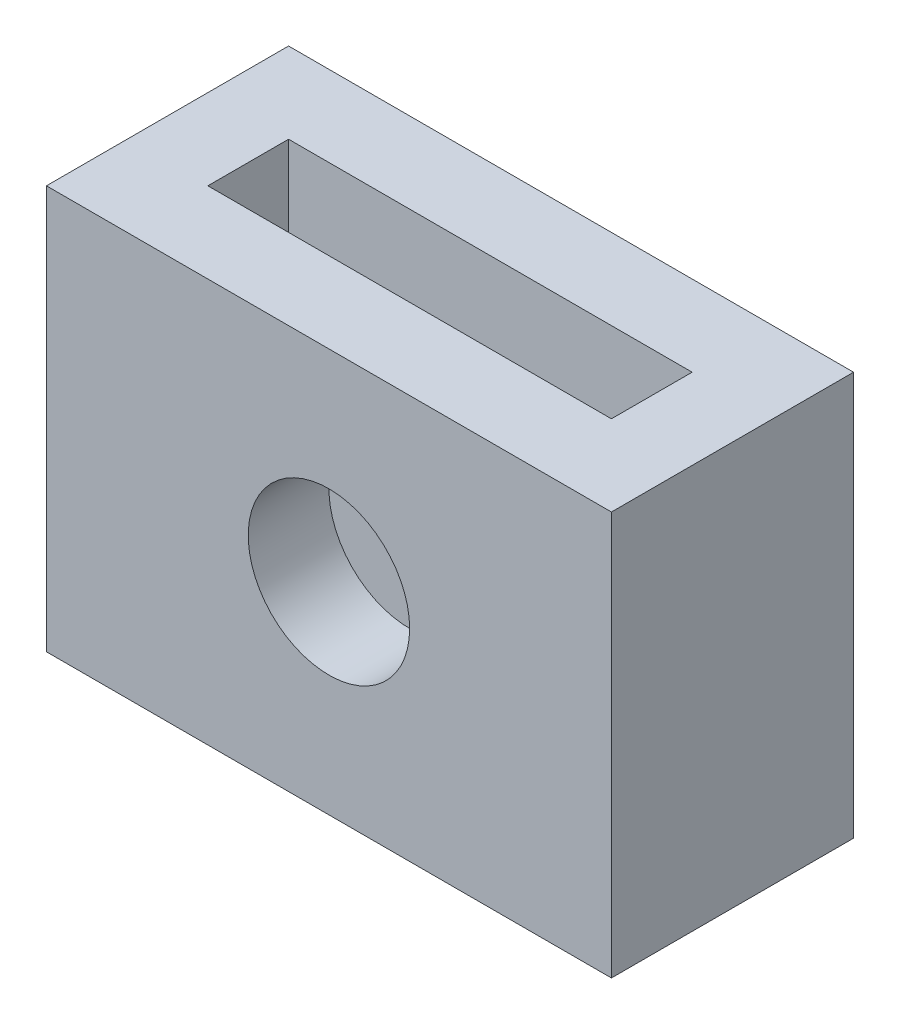
ISO-10303-21;
HEADER;
FILE_DESCRIPTION(('STEP AP214'),'2;1');
FILE_NAME('part.step','',(''),(''),'','','');
FILE_SCHEMA(('AUTOMOTIVE_DESIGN { 1 0 10303 214 1 1 1 1 }'));
ENDSEC;
DATA;
#1=APPLICATION_CONTEXT('core data for automotive mechanical design processes');
#2=APPLICATION_PROTOCOL_DEFINITION('international standard','automotive_design',2000,#1);
#3=PRODUCT_CONTEXT('',#1,'mechanical');
#4=PRODUCT('Part','Part','',(#3));
#5=PRODUCT_RELATED_PRODUCT_CATEGORY('part','',(#4));
#6=PRODUCT_DEFINITION_FORMATION('','',#4);
#7=PRODUCT_DEFINITION_CONTEXT('part definition',#1,'design');
#8=PRODUCT_DEFINITION('design','',#6,#7);
#9=PRODUCT_DEFINITION_SHAPE('','',#8);
#10=(LENGTH_UNIT() NAMED_UNIT(*) SI_UNIT(.MILLI.,.METRE.));
#11=(NAMED_UNIT(*) PLANE_ANGLE_UNIT() SI_UNIT($,.RADIAN.));
#12=(NAMED_UNIT(*) SI_UNIT($,.STERADIAN.) SOLID_ANGLE_UNIT());
#13=UNCERTAINTY_MEASURE_WITH_UNIT(LENGTH_MEASURE(1.E-05),#10,'distance_accuracy_value','');
#14=(GEOMETRIC_REPRESENTATION_CONTEXT(3) GLOBAL_UNCERTAINTY_ASSIGNED_CONTEXT((#13)) GLOBAL_UNIT_ASSIGNED_CONTEXT((#10,
#11,#12)) REPRESENTATION_CONTEXT('',''));
#15=CARTESIAN_POINT('',(0.,0.,0.));
#16=DIRECTION('',(0.,0.,1.));
#17=DIRECTION('',(1.,0.,0.));
#18=AXIS2_PLACEMENT_3D('',#15,#16,#17);
#19=CARTESIAN_POINT('',(0.,0.,30.));
#20=DIRECTION('',(0.,1.,0.));
#21=DIRECTION('',(0.,0.,1.));
#22=AXIS2_PLACEMENT_3D('',#19,#20,#21);
#23=PLANE('',#22);
#24=DIRECTION('',(1.,0.,0.));
#25=VECTOR('',#24,1.);
#26=CARTESIAN_POINT('',(0.,0.,0.));
#27=LINE('',#26,#25);
#28=CARTESIAN_POINT('',(0.,0.,0.));
#29=VERTEX_POINT('',#28);
#30=CARTESIAN_POINT('',(70.,0.,0.));
#31=VERTEX_POINT('',#30);
#32=EDGE_CURVE('E142',#29,#31,#27,.T.);
#33=ORIENTED_EDGE('',*,*,#32,.T.);
#34=DIRECTION('',(0.,0.,-1.));
#35=VECTOR('',#34,1.);
#36=CARTESIAN_POINT('',(70.,0.,30.));
#37=LINE('',#36,#35);
#38=CARTESIAN_POINT('',(70.,0.,30.));
#39=VERTEX_POINT('',#38);
#40=EDGE_CURVE('E152',#39,#31,#37,.T.);
#41=ORIENTED_EDGE('',*,*,#40,.F.);
#42=DIRECTION('',(1.,0.,0.));
#43=VECTOR('',#42,1.);
#44=CARTESIAN_POINT('',(0.,0.,30.));
#45=LINE('',#44,#43);
#46=CARTESIAN_POINT('',(0.,0.,30.));
#47=VERTEX_POINT('',#46);
#48=EDGE_CURVE('E132',#47,#39,#45,.T.);
#49=ORIENTED_EDGE('',*,*,#48,.F.);
#50=DIRECTION('',(0.,0.,-1.));
#51=VECTOR('',#50,1.);
#52=CARTESIAN_POINT('',(0.,0.,30.));
#53=LINE('',#52,#51);
#54=EDGE_CURVE('E155',#47,#29,#53,.T.);
#55=ORIENTED_EDGE('',*,*,#54,.T.);
#56=EDGE_LOOP('',(#33,#41,#49,#55));
#57=FACE_BOUND('',#56,.T.);
#58=DIRECTION('',(1.,0.,0.));
#59=VECTOR('',#58,1.);
#60=CARTESIAN_POINT('',(60.,0.,20.));
#61=LINE('',#60,#59);
#62=CARTESIAN_POINT('',(10.,0.,20.));
#63=VERTEX_POINT('',#62);
#64=CARTESIAN_POINT('',(60.,0.,20.));
#65=VERTEX_POINT('',#64);
#66=EDGE_CURVE('E48',#63,#65,#61,.T.);
#67=ORIENTED_EDGE('',*,*,#66,.T.);
#68=DIRECTION('',(0.,0.,-1.));
#69=VECTOR('',#68,1.);
#70=CARTESIAN_POINT('',(60.,0.,10.));
#71=LINE('',#70,#69);
#72=CARTESIAN_POINT('',(60.,0.,10.));
#73=VERTEX_POINT('',#72);
#74=EDGE_CURVE('E106',#65,#73,#71,.T.);
#75=ORIENTED_EDGE('',*,*,#74,.T.);
#76=DIRECTION('',(-1.,0.,0.));
#77=VECTOR('',#76,1.);
#78=CARTESIAN_POINT('',(10.,0.,10.));
#79=LINE('',#78,#77);
#80=CARTESIAN_POINT('',(10.,0.,10.));
#81=VERTEX_POINT('',#80);
#82=EDGE_CURVE('E112',#73,#81,#79,.T.);
#83=ORIENTED_EDGE('',*,*,#82,.T.);
#84=DIRECTION('',(0.,0.,1.));
#85=VECTOR('',#84,1.);
#86=CARTESIAN_POINT('',(10.,0.,20.));
#87=LINE('',#86,#85);
#88=EDGE_CURVE('E115',#81,#63,#87,.T.);
#89=ORIENTED_EDGE('',*,*,#88,.T.);
#90=EDGE_LOOP('',(#67,#75,#83,#89));
#91=FACE_BOUND('',#90,.T.);
#92=ADVANCED_FACE('F33',(#57,#91),#23,.F.);
#93=CARTESIAN_POINT('',(70.,50.,30.));
#94=DIRECTION('',(0.,-1.,0.));
#95=DIRECTION('',(1.,0.,0.));
#96=AXIS2_PLACEMENT_3D('',#93,#94,#95);
#97=PLANE('',#96);
#98=DIRECTION('',(-1.,0.,0.));
#99=VECTOR('',#98,1.);
#100=CARTESIAN_POINT('',(70.,50.,0.));
#101=LINE('',#100,#99);
#102=CARTESIAN_POINT('',(70.,50.,0.));
#103=VERTEX_POINT('',#102);
#104=CARTESIAN_POINT('',(0.,50.,0.));
#105=VERTEX_POINT('',#104);
#106=EDGE_CURVE('E133',#103,#105,#101,.T.);
#107=ORIENTED_EDGE('',*,*,#106,.T.);
#108=DIRECTION('',(0.,0.,-1.));
#109=VECTOR('',#108,1.);
#110=CARTESIAN_POINT('',(0.,50.,30.));
#111=LINE('',#110,#109);
#112=CARTESIAN_POINT('',(0.,50.,30.));
#113=VERTEX_POINT('',#112);
#114=EDGE_CURVE('E139',#113,#105,#111,.T.);
#115=ORIENTED_EDGE('',*,*,#114,.F.);
#116=DIRECTION('',(-1.,0.,0.));
#117=VECTOR('',#116,1.);
#118=CARTESIAN_POINT('',(70.,50.,30.));
#119=LINE('',#118,#117);
#120=CARTESIAN_POINT('',(70.,50.,30.));
#121=VERTEX_POINT('',#120);
#122=EDGE_CURVE('E137',#121,#113,#119,.T.);
#123=ORIENTED_EDGE('',*,*,#122,.F.);
#124=DIRECTION('',(0.,0.,-1.));
#125=VECTOR('',#124,1.);
#126=CARTESIAN_POINT('',(70.,50.,30.));
#127=LINE('',#126,#125);
#128=EDGE_CURVE('E149',#121,#103,#127,.T.);
#129=ORIENTED_EDGE('',*,*,#128,.T.);
#130=EDGE_LOOP('',(#107,#115,#123,#129));
#131=FACE_BOUND('',#130,.T.);
#132=DIRECTION('',(1.,0.,0.));
#133=VECTOR('',#132,1.);
#134=CARTESIAN_POINT('',(70.,50.,20.));
#135=LINE('',#134,#133);
#136=CARTESIAN_POINT('',(10.,50.,20.));
#137=VERTEX_POINT('',#136);
#138=CARTESIAN_POINT('',(60.,50.,20.));
#139=VERTEX_POINT('',#138);
#140=EDGE_CURVE('E11',#137,#139,#135,.T.);
#141=ORIENTED_EDGE('',*,*,#140,.F.);
#142=DIRECTION('',(0.,0.,1.));
#143=VECTOR('',#142,1.);
#144=CARTESIAN_POINT('',(10.,50.,30.));
#145=LINE('',#144,#143);
#146=CARTESIAN_POINT('',(10.,50.,10.));
#147=VERTEX_POINT('',#146);
#148=EDGE_CURVE('E158',#147,#137,#145,.T.);
#149=ORIENTED_EDGE('',*,*,#148,.F.);
#150=DIRECTION('',(-1.,0.,0.));
#151=VECTOR('',#150,1.);
#152=CARTESIAN_POINT('',(70.,50.,10.));
#153=LINE('',#152,#151);
#154=CARTESIAN_POINT('',(60.,50.,10.));
#155=VERTEX_POINT('',#154);
#156=EDGE_CURVE('E160',#155,#147,#153,.T.);
#157=ORIENTED_EDGE('',*,*,#156,.F.);
#158=DIRECTION('',(0.,0.,-1.));
#159=VECTOR('',#158,1.);
#160=CARTESIAN_POINT('',(60.,50.,30.));
#161=LINE('',#160,#159);
#162=EDGE_CURVE('E41',#139,#155,#161,.T.);
#163=ORIENTED_EDGE('',*,*,#162,.F.);
#164=EDGE_LOOP('',(#141,#149,#157,#163));
#165=FACE_BOUND('',#164,.T.);
#166=ADVANCED_FACE('F166',(#131,#165),#97,.F.);
#167=CARTESIAN_POINT('',(0.,50.,30.));
#168=DIRECTION('',(1.,0.,0.));
#169=DIRECTION('',(0.,0.,-1.));
#170=AXIS2_PLACEMENT_3D('',#167,#168,#169);
#171=PLANE('',#170);
#172=DIRECTION('',(0.,-1.,0.));
#173=VECTOR('',#172,1.);
#174=CARTESIAN_POINT('',(0.,50.,0.));
#175=LINE('',#174,#173);
#176=EDGE_CURVE('E102',#105,#29,#175,.T.);
#177=ORIENTED_EDGE('',*,*,#176,.T.);
#178=ORIENTED_EDGE('',*,*,#54,.F.);
#179=DIRECTION('',(0.,-1.,0.));
#180=VECTOR('',#179,1.);
#181=CARTESIAN_POINT('',(0.,50.,30.));
#182=LINE('',#181,#180);
#183=EDGE_CURVE('E129',#113,#47,#182,.T.);
#184=ORIENTED_EDGE('',*,*,#183,.F.);
#185=ORIENTED_EDGE('',*,*,#114,.T.);
#186=EDGE_LOOP('',(#177,#178,#184,#185));
#187=FACE_BOUND('',#186,.T.);
#188=ADVANCED_FACE('F35',(#187),#171,.F.);
#189=CARTESIAN_POINT('',(70.,0.,30.));
#190=DIRECTION('',(-1.,0.,0.));
#191=DIRECTION('',(0.,0.,1.));
#192=AXIS2_PLACEMENT_3D('',#189,#190,#191);
#193=PLANE('',#192);
#194=DIRECTION('',(0.,1.,0.));
#195=VECTOR('',#194,1.);
#196=CARTESIAN_POINT('',(70.,0.,0.));
#197=LINE('',#196,#195);
#198=EDGE_CURVE('E144',#31,#103,#197,.T.);
#199=ORIENTED_EDGE('',*,*,#198,.T.);
#200=ORIENTED_EDGE('',*,*,#128,.F.);
#201=DIRECTION('',(0.,1.,0.));
#202=VECTOR('',#201,1.);
#203=CARTESIAN_POINT('',(70.,0.,30.));
#204=LINE('',#203,#202);
#205=EDGE_CURVE('E135',#39,#121,#204,.T.);
#206=ORIENTED_EDGE('',*,*,#205,.F.);
#207=ORIENTED_EDGE('',*,*,#40,.T.);
#208=EDGE_LOOP('',(#199,#200,#206,#207));
#209=FACE_BOUND('',#208,.T.);
#210=ADVANCED_FACE('F186',(#209),#193,.F.);
#211=CARTESIAN_POINT('',(0.,0.,30.));
#212=DIRECTION('',(0.,0.,1.));
#213=DIRECTION('',(1.,0.,0.));
#214=AXIS2_PLACEMENT_3D('',#211,#212,#213);
#215=PLANE('',#214);
#216=CARTESIAN_POINT('',(35.,25.,30.));
#217=DIRECTION('',(0.,0.,1.));
#218=DIRECTION('',(1.,0.,0.));
#219=AXIS2_PLACEMENT_3D('',#216,#217,#218);
#220=CIRCLE('',#219,10.);
#221=CARTESIAN_POINT('',(45.,25.,30.));
#222=VERTEX_POINT('',#221);
#223=EDGE_CURVE('E119',#222,#222,#220,.T.);
#224=ORIENTED_EDGE('',*,*,#223,.F.);
#225=EDGE_LOOP('',(#224));
#226=FACE_BOUND('',#225,.T.);
#227=ORIENTED_EDGE('',*,*,#183,.T.);
#228=ORIENTED_EDGE('',*,*,#48,.T.);
#229=ORIENTED_EDGE('',*,*,#205,.T.);
#230=ORIENTED_EDGE('',*,*,#122,.T.);
#231=EDGE_LOOP('',(#227,#228,#229,#230));
#232=FACE_BOUND('',#231,.T.);
#233=ADVANCED_FACE('F188',(#226,#232),#215,.T.);
#234=CARTESIAN_POINT('',(0.,0.,0.));
#235=DIRECTION('',(0.,0.,1.));
#236=DIRECTION('',(1.,0.,0.));
#237=AXIS2_PLACEMENT_3D('',#234,#235,#236);
#238=PLANE('',#237);
#239=ORIENTED_EDGE('',*,*,#176,.F.);
#240=ORIENTED_EDGE('',*,*,#106,.F.);
#241=ORIENTED_EDGE('',*,*,#198,.F.);
#242=ORIENTED_EDGE('',*,*,#32,.F.);
#243=EDGE_LOOP('',(#239,#240,#241,#242));
#244=FACE_BOUND('',#243,.T.);
#245=ADVANCED_FACE('F191',(#244),#238,.F.);
#246=CARTESIAN_POINT('',(60.,67.,20.));
#247=DIRECTION('',(0.,0.,-1.));
#248=DIRECTION('',(-1.,0.,0.));
#249=AXIS2_PLACEMENT_3D('',#246,#247,#248);
#250=PLANE('',#249);
#251=CARTESIAN_POINT('',(35.,25.,20.));
#252=DIRECTION('',(0.,0.,1.));
#253=DIRECTION('',(1.,0.,0.));
#254=AXIS2_PLACEMENT_3D('',#251,#252,#253);
#255=CIRCLE('',#254,10.);
#256=CARTESIAN_POINT('',(45.,25.,20.));
#257=VERTEX_POINT('',#256);
#258=EDGE_CURVE('E116',#257,#257,#255,.T.);
#259=ORIENTED_EDGE('',*,*,#258,.T.);
#260=EDGE_LOOP('',(#259));
#261=FACE_BOUND('',#260,.T.);
#262=ORIENTED_EDGE('',*,*,#140,.T.);
#263=DIRECTION('',(0.,-1.,0.));
#264=VECTOR('',#263,1.);
#265=CARTESIAN_POINT('',(60.,67.,20.));
#266=LINE('',#265,#264);
#267=EDGE_CURVE('E96',#139,#65,#266,.T.);
#268=ORIENTED_EDGE('',*,*,#267,.T.);
#269=ORIENTED_EDGE('',*,*,#66,.F.);
#270=DIRECTION('',(0.,-1.,0.));
#271=VECTOR('',#270,1.);
#272=CARTESIAN_POINT('',(10.,67.,20.));
#273=LINE('',#272,#271);
#274=EDGE_CURVE('E125',#137,#63,#273,.T.);
#275=ORIENTED_EDGE('',*,*,#274,.F.);
#276=EDGE_LOOP('',(#262,#268,#269,#275));
#277=FACE_BOUND('',#276,.T.);
#278=ADVANCED_FACE('F98',(#261,#277),#250,.T.);
#279=CARTESIAN_POINT('',(60.,67.,10.));
#280=DIRECTION('',(-1.,0.,0.));
#281=DIRECTION('',(0.,0.,1.));
#282=AXIS2_PLACEMENT_3D('',#279,#280,#281);
#283=PLANE('',#282);
#284=ORIENTED_EDGE('',*,*,#162,.T.);
#285=DIRECTION('',(0.,-1.,0.));
#286=VECTOR('',#285,1.);
#287=CARTESIAN_POINT('',(60.,67.,10.));
#288=LINE('',#287,#286);
#289=EDGE_CURVE('E103',#155,#73,#288,.T.);
#290=ORIENTED_EDGE('',*,*,#289,.T.);
#291=ORIENTED_EDGE('',*,*,#74,.F.);
#292=ORIENTED_EDGE('',*,*,#267,.F.);
#293=EDGE_LOOP('',(#284,#290,#291,#292));
#294=FACE_BOUND('',#293,.T.);
#295=ADVANCED_FACE('F107',(#294),#283,.T.);
#296=CARTESIAN_POINT('',(10.,67.,10.));
#297=DIRECTION('',(0.,0.,1.));
#298=DIRECTION('',(1.,0.,0.));
#299=AXIS2_PLACEMENT_3D('',#296,#297,#298);
#300=PLANE('',#299);
#301=ORIENTED_EDGE('',*,*,#156,.T.);
#302=DIRECTION('',(0.,-1.,0.));
#303=VECTOR('',#302,1.);
#304=CARTESIAN_POINT('',(10.,67.,10.));
#305=LINE('',#304,#303);
#306=EDGE_CURVE('E56',#147,#81,#305,.T.);
#307=ORIENTED_EDGE('',*,*,#306,.T.);
#308=ORIENTED_EDGE('',*,*,#82,.F.);
#309=ORIENTED_EDGE('',*,*,#289,.F.);
#310=EDGE_LOOP('',(#301,#307,#308,#309));
#311=FACE_BOUND('',#310,.T.);
#312=ADVANCED_FACE('F164',(#311),#300,.T.);
#313=CARTESIAN_POINT('',(10.,67.,20.));
#314=DIRECTION('',(1.,0.,0.));
#315=DIRECTION('',(0.,0.,-1.));
#316=AXIS2_PLACEMENT_3D('',#313,#314,#315);
#317=PLANE('',#316);
#318=ORIENTED_EDGE('',*,*,#148,.T.);
#319=ORIENTED_EDGE('',*,*,#274,.T.);
#320=ORIENTED_EDGE('',*,*,#88,.F.);
#321=ORIENTED_EDGE('',*,*,#306,.F.);
#322=EDGE_LOOP('',(#318,#319,#320,#321));
#323=FACE_BOUND('',#322,.T.);
#324=ADVANCED_FACE('F167',(#323),#317,.T.);
#325=CARTESIAN_POINT('',(35.,25.,20.));
#326=DIRECTION('',(0.,0.,1.));
#327=DIRECTION('',(1.,0.,0.));
#328=AXIS2_PLACEMENT_3D('',#325,#326,#327);
#329=CYLINDRICAL_SURFACE('',#328,10.);
#330=ORIENTED_EDGE('',*,*,#258,.F.);
#331=EDGE_LOOP('',(#330));
#332=FACE_BOUND('',#331,.T.);
#333=ORIENTED_EDGE('',*,*,#223,.T.);
#334=EDGE_LOOP('',(#333));
#335=FACE_BOUND('',#334,.T.);
#336=ADVANCED_FACE('F169',(#332,#335),#329,.F.);
#337=CLOSED_SHELL('',(#92,#166,#188,#210,#233,#245,#278,#295,#312,#324,#336));
#338=MANIFOLD_SOLID_BREP('B2',#337);
#339=ADVANCED_BREP_SHAPE_REPRESENTATION('',(#18,#338),#14);
#340=SHAPE_DEFINITION_REPRESENTATION(#9,#339);
ENDSEC;
END-ISO-10303-21;
